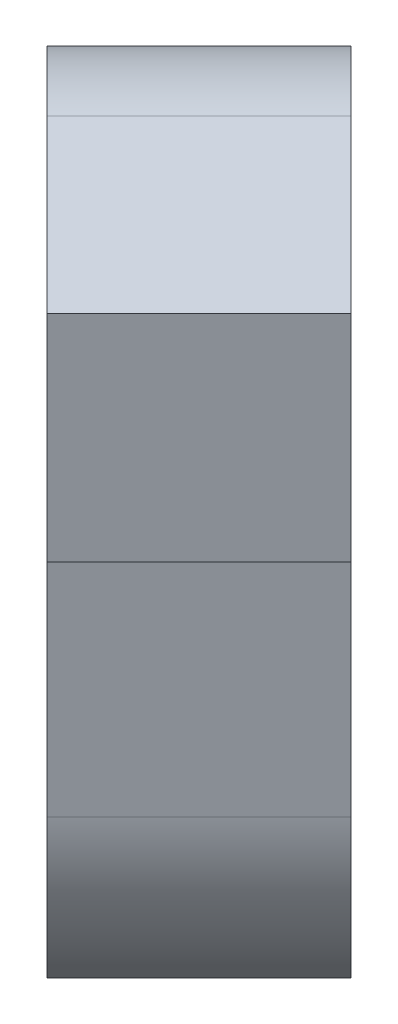
ISO-10303-21;
HEADER;
FILE_DESCRIPTION(('STEP AP214'),'2;1');
FILE_NAME('part.step','',(''),(''),'','','');
FILE_SCHEMA(('AUTOMOTIVE_DESIGN { 1 0 10303 214 1 1 1 1 }'));
ENDSEC;
DATA;
#1=APPLICATION_CONTEXT('core data for automotive mechanical design processes');
#2=APPLICATION_PROTOCOL_DEFINITION('international standard','automotive_design',2000,#1);
#3=PRODUCT_CONTEXT('',#1,'mechanical');
#4=PRODUCT('Part','Part','',(#3));
#5=PRODUCT_RELATED_PRODUCT_CATEGORY('part','',(#4));
#6=PRODUCT_DEFINITION_FORMATION('','',#4);
#7=PRODUCT_DEFINITION_CONTEXT('part definition',#1,'design');
#8=PRODUCT_DEFINITION('design','',#6,#7);
#9=PRODUCT_DEFINITION_SHAPE('','',#8);
#10=(LENGTH_UNIT() NAMED_UNIT(*) SI_UNIT(.MILLI.,.METRE.));
#11=(NAMED_UNIT(*) PLANE_ANGLE_UNIT() SI_UNIT($,.RADIAN.));
#12=(NAMED_UNIT(*) SI_UNIT($,.STERADIAN.) SOLID_ANGLE_UNIT());
#13=UNCERTAINTY_MEASURE_WITH_UNIT(LENGTH_MEASURE(1.E-05),#10,'distance_accuracy_value','');
#14=(GEOMETRIC_REPRESENTATION_CONTEXT(3) GLOBAL_UNCERTAINTY_ASSIGNED_CONTEXT((#13)) GLOBAL_UNIT_ASSIGNED_CONTEXT((#10,
#11,#12)) REPRESENTATION_CONTEXT('',''));
#15=CARTESIAN_POINT('',(0.,0.,0.));
#16=DIRECTION('',(0.,0.,1.));
#17=DIRECTION('',(1.,0.,0.));
#18=AXIS2_PLACEMENT_3D('',#15,#16,#17);
#19=CARTESIAN_POINT('',(7.54120376173845,4.155,-3.41661140182409));
#20=DIRECTION('',(0.707106781186548,0.,-0.707106781186547));
#21=DIRECTION('',(0.,-1.,0.));
#22=AXIS2_PLACEMENT_3D('',#19,#20,#21);
#23=PLANE('',#22);
#24=DIRECTION('',(0.707106781186547,0.,0.707106781186548));
#25=VECTOR('',#24,1.);
#26=CARTESIAN_POINT('',(7.54120376173845,3.505,-3.41661140182409));
#27=LINE('',#26,#25);
#28=CARTESIAN_POINT('',(7.54120376173844,3.505,-3.41661140182409));
#29=VERTEX_POINT('',#28);
#30=CARTESIAN_POINT('',(7.70030278750541,3.505,-3.25751237605712));
#31=VERTEX_POINT('',#30);
#32=EDGE_CURVE('E11',#29,#31,#27,.T.);
#33=ORIENTED_EDGE('',*,*,#32,.F.);
#34=DIRECTION('',(0.,1.,0.));
#35=VECTOR('',#34,1.);
#36=CARTESIAN_POINT('',(7.54120376173845,4.155,-3.41661140182409));
#37=LINE('',#36,#35);
#38=CARTESIAN_POINT('',(7.54120376173845,3.305,-3.41661140182409));
#39=VERTEX_POINT('',#38);
#40=EDGE_CURVE('E24',#39,#29,#37,.T.);
#41=ORIENTED_EDGE('',*,*,#40,.F.);
#42=DIRECTION('',(-0.707106781186547,0.,-0.707106781186548));
#43=VECTOR('',#42,1.);
#44=CARTESIAN_POINT('',(7.54120376173845,3.305,-3.41661140182409));
#45=LINE('',#44,#43);
#46=CARTESIAN_POINT('',(7.70030278750541,3.305,-3.25751237605712));
#47=VERTEX_POINT('',#46);
#48=EDGE_CURVE('E203',#47,#39,#45,.T.);
#49=ORIENTED_EDGE('',*,*,#48,.F.);
#50=CARTESIAN_POINT('',(7.70030278750541,3.555,-3.25751237605712));
#51=DIRECTION('',(0.707106781186549,0.,-0.707106781186547));
#52=DIRECTION('',(0.707106781186547,0.,0.707106781186549));
#53=AXIS2_PLACEMENT_3D('',#50,#51,#52);
#54=CIRCLE('',#53,0.25);
#55=CARTESIAN_POINT('',(7.87707948280204,3.555,-3.08073568076049));
#56=VERTEX_POINT('',#55);
#57=EDGE_CURVE('E200',#56,#47,#54,.T.);
#58=ORIENTED_EDGE('',*,*,#57,.F.);
#59=DIRECTION('',(0.,-1.,0.));
#60=VECTOR('',#59,1.);
#61=CARTESIAN_POINT('',(7.87707948280204,4.155,-3.08073568076049));
#62=LINE('',#61,#60);
#63=CARTESIAN_POINT('',(7.87707948280204,3.905,-3.08073568076049));
#64=VERTEX_POINT('',#63);
#65=EDGE_CURVE('E197',#64,#56,#62,.T.);
#66=ORIENTED_EDGE('',*,*,#65,.F.);
#67=CARTESIAN_POINT('',(7.91243482186138,3.905,-3.04538034170115));
#68=DIRECTION('',(-0.707106781186548,0.,0.707106781186548));
#69=DIRECTION('',(0.707106781186548,0.,0.707106781186548));
#70=AXIS2_PLACEMENT_3D('',#67,#68,#69);
#71=CIRCLE('',#70,0.050000000000016);
#72=CARTESIAN_POINT('',(7.91243482186138,3.955,-3.04538034170115));
#73=VERTEX_POINT('',#72);
#74=EDGE_CURVE('E194',#73,#64,#71,.T.);
#75=ORIENTED_EDGE('',*,*,#74,.F.);
#76=DIRECTION('',(-0.707106781186547,0.,-0.707106781186548));
#77=VECTOR('',#76,1.);
#78=CARTESIAN_POINT('',(7.54120376173845,3.955,-3.41661140182409));
#79=LINE('',#78,#77);
#80=CARTESIAN_POINT('',(8.07153384762835,3.955,-2.88628131593419));
#81=VERTEX_POINT('',#80);
#82=EDGE_CURVE('E191',#81,#73,#79,.T.);
#83=ORIENTED_EDGE('',*,*,#82,.F.);
#84=DIRECTION('',(0.,-1.,0.));
#85=VECTOR('',#84,1.);
#86=CARTESIAN_POINT('',(8.07153384762835,4.155,-2.88628131593419));
#87=LINE('',#86,#85);
#88=CARTESIAN_POINT('',(8.07153384762835,4.155,-2.88628131593419));
#89=VERTEX_POINT('',#88);
#90=EDGE_CURVE('E188',#89,#81,#87,.T.);
#91=ORIENTED_EDGE('',*,*,#90,.F.);
#92=DIRECTION('',(0.707106781186547,0.,0.707106781186548));
#93=VECTOR('',#92,1.);
#94=CARTESIAN_POINT('',(7.54120376173845,4.155,-3.41661140182409));
#95=LINE('',#94,#93);
#96=CARTESIAN_POINT('',(7.91243482186138,4.155,-3.04538034170115));
#97=VERTEX_POINT('',#96);
#98=EDGE_CURVE('E185',#97,#89,#95,.T.);
#99=ORIENTED_EDGE('',*,*,#98,.F.);
#100=CARTESIAN_POINT('',(7.91243482186138,3.905,-3.04538034170115));
#101=DIRECTION('',(0.707106781186547,0.,-0.707106781186548));
#102=DIRECTION('',(0.707106781186548,0.,0.707106781186547));
#103=AXIS2_PLACEMENT_3D('',#100,#101,#102);
#104=CIRCLE('',#103,0.250000000000001);
#105=CARTESIAN_POINT('',(7.73565812656474,3.905,-3.22215703699779));
#106=VERTEX_POINT('',#105);
#107=EDGE_CURVE('E183',#106,#97,#104,.T.);
#108=ORIENTED_EDGE('',*,*,#107,.F.);
#109=DIRECTION('',(0.,1.,0.));
#110=VECTOR('',#109,1.);
#111=CARTESIAN_POINT('',(7.73565812656475,4.155,-3.22215703699779));
#112=LINE('',#111,#110);
#113=CARTESIAN_POINT('',(7.73565812656474,3.555,-3.22215703699779));
#114=VERTEX_POINT('',#113);
#115=EDGE_CURVE('E108',#114,#106,#112,.T.);
#116=ORIENTED_EDGE('',*,*,#115,.F.);
#117=CARTESIAN_POINT('',(7.70030278750541,3.555,-3.25751237605712));
#118=DIRECTION('',(-0.707106781186548,0.,0.707106781186548));
#119=DIRECTION('',(0.707106781186548,0.,0.707106781186548));
#120=AXIS2_PLACEMENT_3D('',#117,#118,#119);
#121=CIRCLE('',#120,0.050000000000016);
#122=EDGE_CURVE('E179',#31,#114,#121,.T.);
#123=ORIENTED_EDGE('',*,*,#122,.F.);
#124=EDGE_LOOP('',(#33,#41,#49,#58,#66,#75,#83,#91,#99,#108,#116,#123));
#125=FACE_BOUND('',#124,.T.);
#126=ADVANCED_FACE('F17',(#125),#23,.F.);
#127=CARTESIAN_POINT('',(9.6930582617584,3.555,-5.25026785031012));
#128=DIRECTION('',(-0.707106781186548,0.,0.707106781186548));
#129=DIRECTION('',(0.707106781186548,0.,0.707106781186548));
#130=AXIS2_PLACEMENT_3D('',#127,#128,#129);
#131=CYLINDRICAL_SURFACE('',#130,0.050000000000016);
#132=CARTESIAN_POINT('',(7.84172414374272,3.555,-3.39893373229443));
#133=DIRECTION('',(-0.707106781186548,0.,0.707106781186548));
#134=DIRECTION('',(0.707106781186548,0.,0.707106781186548));
#135=AXIS2_PLACEMENT_3D('',#132,#133,#134);
#136=CIRCLE('',#135,0.050000000000016);
#137=CARTESIAN_POINT('',(7.84172414374272,3.505,-3.39893373229443));
#138=VERTEX_POINT('',#137);
#139=CARTESIAN_POINT('',(7.87707948280205,3.555,-3.3635783932351));
#140=VERTEX_POINT('',#139);
#141=EDGE_CURVE('E125',#138,#140,#136,.T.);
#142=ORIENTED_EDGE('',*,*,#141,.F.);
#143=DIRECTION('',(0.707106781186548,0.,-0.707106781186548));
#144=VECTOR('',#143,1.);
#145=CARTESIAN_POINT('',(9.6930582617584,3.505,-5.25026785031012));
#146=LINE('',#145,#144);
#147=EDGE_CURVE('E176',#31,#138,#146,.T.);
#148=ORIENTED_EDGE('',*,*,#147,.F.);
#149=ORIENTED_EDGE('',*,*,#122,.T.);
#150=DIRECTION('',(-0.707106781186548,0.,0.707106781186548));
#151=VECTOR('',#150,1.);
#152=CARTESIAN_POINT('',(9.72841360081774,3.555,-5.21491251125078));
#153=LINE('',#152,#151);
#154=EDGE_CURVE('E174',#140,#114,#153,.T.);
#155=ORIENTED_EDGE('',*,*,#154,.F.);
#156=EDGE_LOOP('',(#142,#148,#149,#155));
#157=FACE_BOUND('',#156,.T.);
#158=ADVANCED_FACE('F235',(#157),#131,.F.);
#159=CARTESIAN_POINT('',(7.47166305603425,3.505,-7.47166305603427));
#160=DIRECTION('',(0.,-1.,0.));
#161=DIRECTION('',(-1.,0.,0.));
#162=AXIS2_PLACEMENT_3D('',#159,#160,#161);
#163=PLANE('',#162);
#164=DIRECTION('',(0.707106781186546,0.,0.70710678118655));
#165=VECTOR('',#164,1.);
#166=CARTESIAN_POINT('',(7.68262511797575,3.505,-3.5580327580614));
#167=LINE('',#166,#165);
#168=CARTESIAN_POINT('',(7.68262511797575,3.505,-3.5580327580614));
#169=VERTEX_POINT('',#168);
#170=EDGE_CURVE('E172',#169,#138,#167,.T.);
#171=ORIENTED_EDGE('',*,*,#170,.F.);
#172=DIRECTION('',(0.707106781186545,0.,-0.70710678118655));
#173=VECTOR('',#172,1.);
#174=CARTESIAN_POINT('',(7.54120376173844,3.505,-3.41661140182409));
#175=LINE('',#174,#173);
#176=EDGE_CURVE('E169',#29,#169,#175,.T.);
#177=ORIENTED_EDGE('',*,*,#176,.F.);
#178=ORIENTED_EDGE('',*,*,#32,.T.);
#179=ORIENTED_EDGE('',*,*,#147,.T.);
#180=EDGE_LOOP('',(#171,#177,#178,#179));
#181=FACE_BOUND('',#180,.T.);
#182=ADVANCED_FACE('F208',(#181),#163,.F.);
#183=CARTESIAN_POINT('',(7.54120376173845,4.155,-3.41661140182409));
#184=DIRECTION('',(0.707106781186547,0.,0.707106781186549));
#185=DIRECTION('',(0.,-1.,0.));
#186=AXIS2_PLACEMENT_3D('',#183,#184,#185);
#187=PLANE('',#186);
#188=ORIENTED_EDGE('',*,*,#176,.T.);
#189=DIRECTION('',(0.,1.,0.));
#190=VECTOR('',#189,1.);
#191=CARTESIAN_POINT('',(7.68262511797575,4.155,-3.55803275806139));
#192=LINE('',#191,#190);
#193=CARTESIAN_POINT('',(7.68262511797575,3.305,-3.55803275806139));
#194=VERTEX_POINT('',#193);
#195=EDGE_CURVE('E166',#194,#169,#192,.T.);
#196=ORIENTED_EDGE('',*,*,#195,.F.);
#197=DIRECTION('',(0.707106781186549,0.,-0.707106781186547));
#198=VECTOR('',#197,1.);
#199=CARTESIAN_POINT('',(7.54120376173845,3.305,-3.41661140182409));
#200=LINE('',#199,#198);
#201=EDGE_CURVE('E163',#39,#194,#200,.T.);
#202=ORIENTED_EDGE('',*,*,#201,.F.);
#203=ORIENTED_EDGE('',*,*,#40,.T.);
#204=EDGE_LOOP('',(#188,#196,#202,#203));
#205=FACE_BOUND('',#204,.T.);
#206=ADVANCED_FACE('F207',(#205),#187,.F.);
#207=CARTESIAN_POINT('',(0.,3.305,0.));
#208=DIRECTION('',(0.,-1.,0.));
#209=DIRECTION('',(0.,0.,-1.));
#210=AXIS2_PLACEMENT_3D('',#207,#208,#209);
#211=PLANE('',#210);
#212=ORIENTED_EDGE('',*,*,#48,.T.);
#213=ORIENTED_EDGE('',*,*,#201,.T.);
#214=DIRECTION('',(0.707106781186549,0.,0.707106781186547));
#215=VECTOR('',#214,1.);
#216=CARTESIAN_POINT('',(7.68262511797575,3.305,-3.5580327580614));
#217=LINE('',#216,#215);
#218=CARTESIAN_POINT('',(7.84172414374272,3.305,-3.39893373229443));
#219=VERTEX_POINT('',#218);
#220=EDGE_CURVE('E161',#194,#219,#217,.T.);
#221=ORIENTED_EDGE('',*,*,#220,.T.);
#222=DIRECTION('',(-0.707106781186548,0.,0.707106781186548));
#223=VECTOR('',#222,1.);
#224=CARTESIAN_POINT('',(7.84172414374272,3.305,-3.39893373229443));
#225=LINE('',#224,#223);
#226=EDGE_CURVE('E158',#219,#47,#225,.T.);
#227=ORIENTED_EDGE('',*,*,#226,.T.);
#228=EDGE_LOOP('',(#212,#213,#221,#227));
#229=FACE_BOUND('',#228,.T.);
#230=ADVANCED_FACE('F213',(#229),#211,.T.);
#231=CARTESIAN_POINT('',(9.6930582617584,3.555,-5.25026785031012));
#232=DIRECTION('',(-0.707106781186548,0.,0.707106781186548));
#233=DIRECTION('',(0.707106781186548,0.,0.707106781186548));
#234=AXIS2_PLACEMENT_3D('',#231,#232,#233);
#235=CYLINDRICAL_SURFACE('',#234,0.25);
#236=CARTESIAN_POINT('',(7.84172414374272,3.555,-3.39893373229443));
#237=DIRECTION('',(-0.707106781186549,0.,0.707106781186547));
#238=DIRECTION('',(0.707106781186547,0.,0.707106781186549));
#239=AXIS2_PLACEMENT_3D('',#236,#237,#238);
#240=CIRCLE('',#239,0.25);
#241=CARTESIAN_POINT('',(8.01850083903935,3.555,-3.2221570369978));
#242=VERTEX_POINT('',#241);
#243=EDGE_CURVE('E156',#219,#242,#240,.T.);
#244=ORIENTED_EDGE('',*,*,#243,.T.);
#245=DIRECTION('',(-0.707106781186548,0.,0.707106781186548));
#246=VECTOR('',#245,1.);
#247=CARTESIAN_POINT('',(9.86983495705504,3.555,-5.07349115501349));
#248=LINE('',#247,#246);
#249=EDGE_CURVE('E153',#242,#56,#248,.T.);
#250=ORIENTED_EDGE('',*,*,#249,.T.);
#251=ORIENTED_EDGE('',*,*,#57,.T.);
#252=ORIENTED_EDGE('',*,*,#226,.F.);
#253=EDGE_LOOP('',(#244,#250,#251,#252));
#254=FACE_BOUND('',#253,.T.);
#255=ADVANCED_FACE('F216',(#254),#235,.T.);
#256=CARTESIAN_POINT('',(9.86983495705504,0.,-5.07349115501349));
#257=DIRECTION('',(0.707106781186548,0.,0.707106781186548));
#258=DIRECTION('',(0.,-1.,0.));
#259=AXIS2_PLACEMENT_3D('',#256,#257,#258);
#260=PLANE('',#259);
#261=DIRECTION('',(0.,1.,0.));
#262=VECTOR('',#261,1.);
#263=CARTESIAN_POINT('',(8.01850083903935,0.,-3.2221570369978));
#264=LINE('',#263,#262);
#265=CARTESIAN_POINT('',(8.01850083903935,3.905,-3.2221570369978));
#266=VERTEX_POINT('',#265);
#267=EDGE_CURVE('E151',#242,#266,#264,.T.);
#268=ORIENTED_EDGE('',*,*,#267,.T.);
#269=DIRECTION('',(-0.707106781186548,0.,0.707106781186548));
#270=VECTOR('',#269,1.);
#271=CARTESIAN_POINT('',(9.86983495705504,3.905,-5.07349115501349));
#272=LINE('',#271,#270);
#273=EDGE_CURVE('E148',#266,#64,#272,.T.);
#274=ORIENTED_EDGE('',*,*,#273,.T.);
#275=ORIENTED_EDGE('',*,*,#65,.T.);
#276=ORIENTED_EDGE('',*,*,#249,.F.);
#277=EDGE_LOOP('',(#268,#274,#275,#276));
#278=FACE_BOUND('',#277,.T.);
#279=ADVANCED_FACE('F220',(#278),#260,.T.);
#280=CARTESIAN_POINT('',(9.90519029611437,3.905,-5.03813581595415));
#281=DIRECTION('',(-0.707106781186548,0.,0.707106781186548));
#282=DIRECTION('',(0.707106781186548,0.,0.707106781186548));
#283=AXIS2_PLACEMENT_3D('',#280,#281,#282);
#284=CYLINDRICAL_SURFACE('',#283,0.050000000000016);
#285=CARTESIAN_POINT('',(8.05385617809869,3.905,-3.18680169793846));
#286=DIRECTION('',(-0.707106781186548,0.,0.707106781186548));
#287=DIRECTION('',(0.707106781186548,0.,0.707106781186548));
#288=AXIS2_PLACEMENT_3D('',#285,#286,#287);
#289=CIRCLE('',#288,0.050000000000016);
#290=CARTESIAN_POINT('',(8.05385617809869,3.955,-3.18680169793846));
#291=VERTEX_POINT('',#290);
#292=EDGE_CURVE('E145',#291,#266,#289,.T.);
#293=ORIENTED_EDGE('',*,*,#292,.F.);
#294=DIRECTION('',(0.707106781186548,0.,-0.707106781186548));
#295=VECTOR('',#294,1.);
#296=CARTESIAN_POINT('',(9.90519029611437,3.955,-5.03813581595415));
#297=LINE('',#296,#295);
#298=EDGE_CURVE('E143',#73,#291,#297,.T.);
#299=ORIENTED_EDGE('',*,*,#298,.F.);
#300=ORIENTED_EDGE('',*,*,#74,.T.);
#301=ORIENTED_EDGE('',*,*,#273,.F.);
#302=EDGE_LOOP('',(#293,#299,#300,#301));
#303=FACE_BOUND('',#302,.T.);
#304=ADVANCED_FACE('F225',(#303),#284,.F.);
#305=CARTESIAN_POINT('',(7.47166305603425,3.955,-7.47166305603427));
#306=DIRECTION('',(0.,1.,0.));
#307=DIRECTION('',(1.,0.,0.));
#308=AXIS2_PLACEMENT_3D('',#305,#306,#307);
#309=PLANE('',#308);
#310=DIRECTION('',(-0.707106781186548,0.,-0.707106781186548));
#311=VECTOR('',#310,1.);
#312=CARTESIAN_POINT('',(8.21295520386566,3.955,-3.0277026721715));
#313=LINE('',#312,#311);
#314=CARTESIAN_POINT('',(8.21295520386566,3.955,-3.0277026721715));
#315=VERTEX_POINT('',#314);
#316=EDGE_CURVE('E140',#315,#291,#313,.T.);
#317=ORIENTED_EDGE('',*,*,#316,.F.);
#318=DIRECTION('',(0.707106781186543,0.,-0.707106781186552));
#319=VECTOR('',#318,1.);
#320=CARTESIAN_POINT('',(8.07153384762835,3.955,-2.88628131593419));
#321=LINE('',#320,#319);
#322=EDGE_CURVE('E137',#81,#315,#321,.T.);
#323=ORIENTED_EDGE('',*,*,#322,.F.);
#324=ORIENTED_EDGE('',*,*,#82,.T.);
#325=ORIENTED_EDGE('',*,*,#298,.T.);
#326=EDGE_LOOP('',(#317,#323,#324,#325));
#327=FACE_BOUND('',#326,.T.);
#328=ADVANCED_FACE('F228',(#327),#309,.F.);
#329=CARTESIAN_POINT('',(8.07153384762835,4.155,-2.88628131593419));
#330=DIRECTION('',(-0.707106781186549,0.,-0.707106781186547));
#331=DIRECTION('',(-0.707106781186547,0.,0.707106781186549));
#332=AXIS2_PLACEMENT_3D('',#329,#330,#331);
#333=PLANE('',#332);
#334=ORIENTED_EDGE('',*,*,#322,.T.);
#335=DIRECTION('',(0.,-1.,0.));
#336=VECTOR('',#335,1.);
#337=CARTESIAN_POINT('',(8.21295520386566,4.155,-3.0277026721715));
#338=LINE('',#337,#336);
#339=CARTESIAN_POINT('',(8.21295520386566,4.155,-3.0277026721715));
#340=VERTEX_POINT('',#339);
#341=EDGE_CURVE('E134',#340,#315,#338,.T.);
#342=ORIENTED_EDGE('',*,*,#341,.F.);
#343=DIRECTION('',(0.707106781186547,0.,-0.707106781186549));
#344=VECTOR('',#343,1.);
#345=CARTESIAN_POINT('',(8.07153384762835,4.155,-2.88628131593419));
#346=LINE('',#345,#344);
#347=EDGE_CURVE('E131',#89,#340,#346,.T.);
#348=ORIENTED_EDGE('',*,*,#347,.F.);
#349=ORIENTED_EDGE('',*,*,#90,.T.);
#350=EDGE_LOOP('',(#334,#342,#348,#349));
#351=FACE_BOUND('',#350,.T.);
#352=ADVANCED_FACE('F230',(#351),#333,.F.);
#353=CARTESIAN_POINT('',(0.,4.155,0.));
#354=DIRECTION('',(0.,-1.,0.));
#355=DIRECTION('',(0.,0.,-1.));
#356=AXIS2_PLACEMENT_3D('',#353,#354,#355);
#357=PLANE('',#356);
#358=ORIENTED_EDGE('',*,*,#98,.T.);
#359=ORIENTED_EDGE('',*,*,#347,.T.);
#360=DIRECTION('',(0.707106781186546,0.,0.707106781186549));
#361=VECTOR('',#360,1.);
#362=CARTESIAN_POINT('',(8.05385617809869,4.155,-3.18680169793846));
#363=LINE('',#362,#361);
#364=CARTESIAN_POINT('',(8.05385617809869,4.155,-3.18680169793846));
#365=VERTEX_POINT('',#364);
#366=EDGE_CURVE('E129',#365,#340,#363,.T.);
#367=ORIENTED_EDGE('',*,*,#366,.F.);
#368=DIRECTION('',(0.707106781186546,0.,-0.707106781186549));
#369=VECTOR('',#368,1.);
#370=CARTESIAN_POINT('',(7.91243482186138,4.155,-3.04538034170115));
#371=LINE('',#370,#369);
#372=EDGE_CURVE('E111',#97,#365,#371,.T.);
#373=ORIENTED_EDGE('',*,*,#372,.F.);
#374=EDGE_LOOP('',(#358,#359,#367,#373));
#375=FACE_BOUND('',#374,.T.);
#376=ADVANCED_FACE('F233',(#375),#357,.F.);
#377=CARTESIAN_POINT('',(9.90519029611437,3.905,-5.03813581595415));
#378=DIRECTION('',(-0.707106781186548,0.,0.707106781186548));
#379=DIRECTION('',(0.707106781186548,0.,0.707106781186548));
#380=AXIS2_PLACEMENT_3D('',#377,#378,#379);
#381=CYLINDRICAL_SURFACE('',#380,0.25);
#382=DIRECTION('',(-0.707106781186548,0.,0.707106781186548));
#383=VECTOR('',#382,1.);
#384=CARTESIAN_POINT('',(9.72841360081774,3.905,-5.21491251125078));
#385=LINE('',#384,#383);
#386=CARTESIAN_POINT('',(7.87707948280205,3.905,-3.3635783932351));
#387=VERTEX_POINT('',#386);
#388=EDGE_CURVE('E102',#387,#106,#385,.T.);
#389=ORIENTED_EDGE('',*,*,#388,.T.);
#390=ORIENTED_EDGE('',*,*,#107,.T.);
#391=ORIENTED_EDGE('',*,*,#372,.T.);
#392=CARTESIAN_POINT('',(8.05385617809869,3.905,-3.18680169793846));
#393=DIRECTION('',(-0.707106781186547,0.,0.707106781186548));
#394=DIRECTION('',(0.707106781186548,0.,0.707106781186547));
#395=AXIS2_PLACEMENT_3D('',#392,#393,#394);
#396=CIRCLE('',#395,0.250000000000001);
#397=EDGE_CURVE('E112',#365,#387,#396,.T.);
#398=ORIENTED_EDGE('',*,*,#397,.T.);
#399=EDGE_LOOP('',(#389,#390,#391,#398));
#400=FACE_BOUND('',#399,.T.);
#401=ADVANCED_FACE('F116',(#400),#381,.T.);
#402=CARTESIAN_POINT('',(9.72841360081774,0.,-5.21491251125078));
#403=DIRECTION('',(-0.707106781186548,0.,-0.707106781186548));
#404=DIRECTION('',(-0.707106781186548,0.,0.707106781186548));
#405=AXIS2_PLACEMENT_3D('',#402,#403,#404);
#406=PLANE('',#405);
#407=DIRECTION('',(0.,-1.,0.));
#408=VECTOR('',#407,1.);
#409=CARTESIAN_POINT('',(7.87707948280206,0.,-3.36357839323509));
#410=LINE('',#409,#408);
#411=EDGE_CURVE('E107',#387,#140,#410,.T.);
#412=ORIENTED_EDGE('',*,*,#411,.T.);
#413=ORIENTED_EDGE('',*,*,#154,.T.);
#414=ORIENTED_EDGE('',*,*,#115,.T.);
#415=ORIENTED_EDGE('',*,*,#388,.F.);
#416=EDGE_LOOP('',(#412,#413,#414,#415));
#417=FACE_BOUND('',#416,.T.);
#418=ADVANCED_FACE('F104',(#417),#406,.T.);
#419=CARTESIAN_POINT('',(7.68262511797575,4.155,-3.5580327580614));
#420=DIRECTION('',(-0.707106781186547,0.,0.707106781186548));
#421=DIRECTION('',(0.,1.,0.));
#422=AXIS2_PLACEMENT_3D('',#419,#420,#421);
#423=PLANE('',#422);
#424=ORIENTED_EDGE('',*,*,#170,.T.);
#425=ORIENTED_EDGE('',*,*,#141,.T.);
#426=ORIENTED_EDGE('',*,*,#411,.F.);
#427=ORIENTED_EDGE('',*,*,#397,.F.);
#428=ORIENTED_EDGE('',*,*,#366,.T.);
#429=ORIENTED_EDGE('',*,*,#341,.T.);
#430=ORIENTED_EDGE('',*,*,#316,.T.);
#431=ORIENTED_EDGE('',*,*,#292,.T.);
#432=ORIENTED_EDGE('',*,*,#267,.F.);
#433=ORIENTED_EDGE('',*,*,#243,.F.);
#434=ORIENTED_EDGE('',*,*,#220,.F.);
#435=ORIENTED_EDGE('',*,*,#195,.T.);
#436=EDGE_LOOP('',(#424,#425,#426,#427,#428,#429,#430,#431,#432,#433,#434,#435));
#437=FACE_BOUND('',#436,.T.);
#438=ADVANCED_FACE('F123',(#437),#423,.F.);
#439=CLOSED_SHELL('',(#126,#158,#182,#206,#230,#255,#279,#304,#328,#352,#376,#401,#418,#438));
#440=MANIFOLD_SOLID_BREP('B1',#439);
#441=ADVANCED_BREP_SHAPE_REPRESENTATION('',(#18,#440),#14);
#442=SHAPE_DEFINITION_REPRESENTATION(#9,#441);
ENDSEC;
END-ISO-10303-21;
